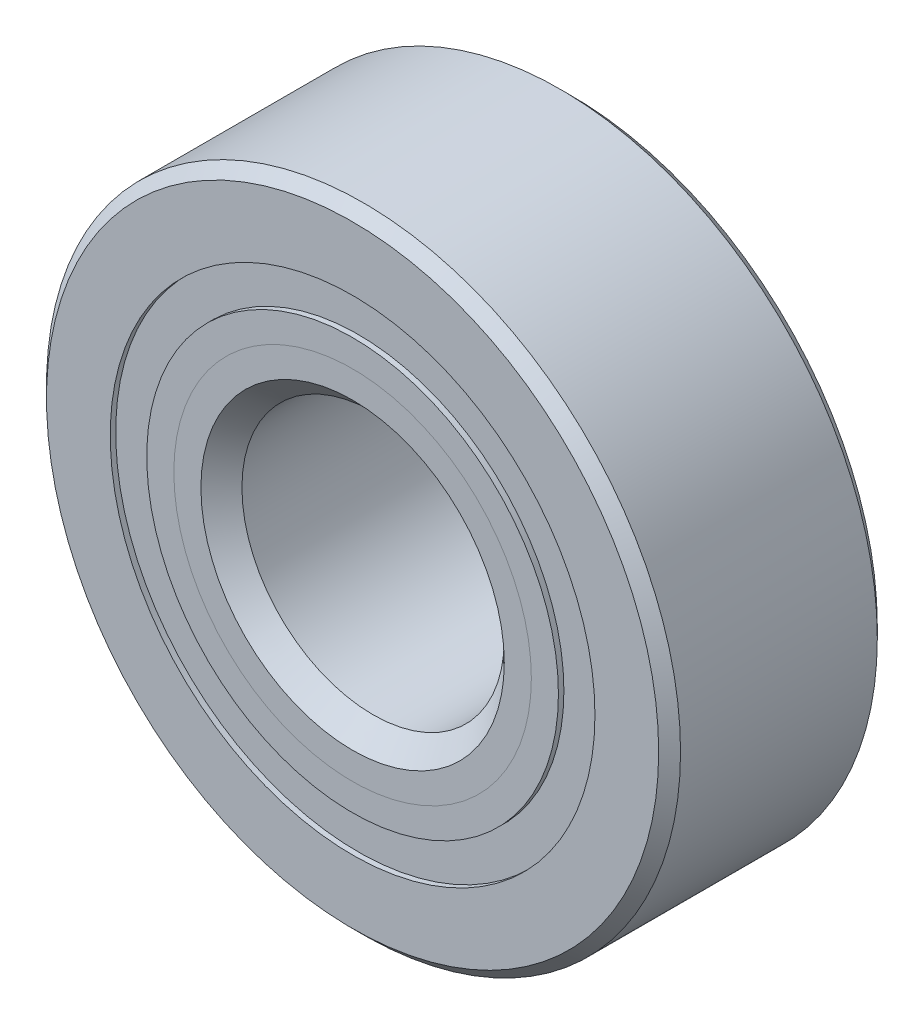
ISO-10303-21;
HEADER;
FILE_DESCRIPTION(('STEP AP214'),'2;1');
FILE_NAME('part.step','',(''),(''),'','','');
FILE_SCHEMA(('AUTOMOTIVE_DESIGN { 1 0 10303 214 1 1 1 1 }'));
ENDSEC;
DATA;
#1=APPLICATION_CONTEXT('core data for automotive mechanical design processes');
#2=APPLICATION_PROTOCOL_DEFINITION('international standard','automotive_design',2000,#1);
#3=PRODUCT_CONTEXT('',#1,'mechanical');
#4=PRODUCT('Part','Part','',(#3));
#5=PRODUCT_RELATED_PRODUCT_CATEGORY('part','',(#4));
#6=PRODUCT_DEFINITION_FORMATION('','',#4);
#7=PRODUCT_DEFINITION_CONTEXT('part definition',#1,'design');
#8=PRODUCT_DEFINITION('design','',#6,#7);
#9=PRODUCT_DEFINITION_SHAPE('','',#8);
#10=(LENGTH_UNIT() NAMED_UNIT(*) SI_UNIT(.MILLI.,.METRE.));
#11=(NAMED_UNIT(*) PLANE_ANGLE_UNIT() SI_UNIT($,.RADIAN.));
#12=(NAMED_UNIT(*) SI_UNIT($,.STERADIAN.) SOLID_ANGLE_UNIT());
#13=UNCERTAINTY_MEASURE_WITH_UNIT(LENGTH_MEASURE(1.E-05),#10,'distance_accuracy_value','');
#14=(GEOMETRIC_REPRESENTATION_CONTEXT(3) GLOBAL_UNCERTAINTY_ASSIGNED_CONTEXT((#13)) GLOBAL_UNIT_ASSIGNED_CONTEXT((#10,
#11,#12)) REPRESENTATION_CONTEXT('',''));
#15=CARTESIAN_POINT('',(0.,0.,0.));
#16=DIRECTION('',(0.,0.,1.));
#17=DIRECTION('',(1.,0.,0.));
#18=AXIS2_PLACEMENT_3D('',#15,#16,#17);
#19=CARTESIAN_POINT('',(0.,8.79884958791209,-3.7703125));
#20=DIRECTION('',(0.,0.,1.));
#21=DIRECTION('',(1.,0.,0.));
#22=AXIS2_PLACEMENT_3D('',#19,#20,#21);
#23=PLANE('',#22);
#24=CARTESIAN_POINT('',(0.,0.,-3.7703125));
#25=DIRECTION('',(0.,0.,1.));
#26=DIRECTION('',(1.,0.,0.));
#27=AXIS2_PLACEMENT_3D('',#24,#25,#26);
#28=CIRCLE('',#27,8.79884958791209);
#29=CARTESIAN_POINT('',(8.79884958791209,0.,-3.7703125));
#30=VERTEX_POINT('',#29);
#31=EDGE_CURVE('E62',#30,#30,#28,.T.);
#32=ORIENTED_EDGE('',*,*,#31,.F.);
#33=EDGE_LOOP('',(#32));
#34=FACE_BOUND('',#33,.T.);
#35=CARTESIAN_POINT('',(0.,0.,-3.7703125));
#36=DIRECTION('',(0.,0.,1.));
#37=DIRECTION('',(1.,0.,0.));
#38=AXIS2_PLACEMENT_3D('',#35,#36,#37);
#39=CIRCLE('',#38,7.47302541208792);
#40=CARTESIAN_POINT('',(7.47302541208792,0.,-3.7703125));
#41=VERTEX_POINT('',#40);
#42=EDGE_CURVE('E11',#41,#41,#39,.T.);
#43=ORIENTED_EDGE('',*,*,#42,.T.);
#44=EDGE_LOOP('',(#43));
#45=FACE_BOUND('',#44,.T.);
#46=ADVANCED_FACE('F48',(#34,#45),#23,.F.);
#47=CARTESIAN_POINT('',(0.,0.,3.96875));
#48=DIRECTION('',(0.,0.,1.));
#49=DIRECTION('',(1.,0.,0.));
#50=AXIS2_PLACEMENT_3D('',#47,#48,#49);
#51=CYLINDRICAL_SURFACE('',#50,7.47302541208792);
#52=ORIENTED_EDGE('',*,*,#42,.F.);
#53=EDGE_LOOP('',(#52));
#54=FACE_BOUND('',#53,.T.);
#55=CARTESIAN_POINT('',(0.,0.,-1.88434509807669));
#56=DIRECTION('',(0.,0.,1.));
#57=DIRECTION('',(1.,0.,0.));
#58=AXIS2_PLACEMENT_3D('',#55,#56,#57);
#59=CIRCLE('',#58,7.47302541208792);
#60=CARTESIAN_POINT('',(7.47302541208792,0.,-1.88434509807669));
#61=VERTEX_POINT('',#60);
#62=EDGE_CURVE('E54',#61,#61,#59,.T.);
#63=ORIENTED_EDGE('',*,*,#62,.T.);
#64=EDGE_LOOP('',(#63));
#65=FACE_BOUND('',#64,.T.);
#66=ADVANCED_FACE('F71',(#54,#65),#51,.F.);
#67=CARTESIAN_POINT('',(0.,8.79884958791209,-1.88434509807669));
#68=DIRECTION('',(0.,0.,-1.));
#69=DIRECTION('',(-1.,0.,0.));
#70=AXIS2_PLACEMENT_3D('',#67,#68,#69);
#71=PLANE('',#70);
#72=ORIENTED_EDGE('',*,*,#62,.F.);
#73=EDGE_LOOP('',(#72));
#74=FACE_BOUND('',#73,.T.);
#75=CARTESIAN_POINT('',(0.,0.,-1.88434509807669));
#76=DIRECTION('',(0.,0.,1.));
#77=DIRECTION('',(1.,0.,0.));
#78=AXIS2_PLACEMENT_3D('',#75,#76,#77);
#79=CIRCLE('',#78,8.79884958791209);
#80=CARTESIAN_POINT('',(8.79884958791209,0.,-1.88434509807669));
#81=VERTEX_POINT('',#80);
#82=EDGE_CURVE('E58',#81,#81,#79,.T.);
#83=ORIENTED_EDGE('',*,*,#82,.T.);
#84=EDGE_LOOP('',(#83));
#85=FACE_BOUND('',#84,.T.);
#86=ADVANCED_FACE('F75',(#74,#85),#71,.F.);
#87=CARTESIAN_POINT('',(0.,0.,3.96875));
#88=DIRECTION('',(0.,0.,1.));
#89=DIRECTION('',(1.,0.,0.));
#90=AXIS2_PLACEMENT_3D('',#87,#88,#89);
#91=CYLINDRICAL_SURFACE('',#90,8.79884958791209);
#92=ORIENTED_EDGE('',*,*,#82,.F.);
#93=EDGE_LOOP('',(#92));
#94=FACE_BOUND('',#93,.T.);
#95=ORIENTED_EDGE('',*,*,#31,.T.);
#96=EDGE_LOOP('',(#95));
#97=FACE_BOUND('',#96,.T.);
#98=ADVANCED_FACE('F68',(#94,#97),#91,.T.);
#99=CLOSED_SHELL('',(#46,#66,#86,#98));
#100=MANIFOLD_SOLID_BREP('B2',#99);
#101=CARTESIAN_POINT('',(0.,8.79884958791209,3.7703125));
#102=DIRECTION('',(0.,0.,-1.));
#103=DIRECTION('',(-1.,0.,0.));
#104=AXIS2_PLACEMENT_3D('',#101,#102,#103);
#105=PLANE('',#104);
#106=CARTESIAN_POINT('',(0.,0.,3.7703125));
#107=DIRECTION('',(0.,0.,1.));
#108=DIRECTION('',(1.,0.,0.));
#109=AXIS2_PLACEMENT_3D('',#106,#107,#108);
#110=CIRCLE('',#109,7.47302541208791);
#111=CARTESIAN_POINT('',(7.47302541208791,0.,3.7703125));
#112=VERTEX_POINT('',#111);
#113=EDGE_CURVE('E47',#112,#112,#110,.T.);
#114=ORIENTED_EDGE('',*,*,#113,.F.);
#115=EDGE_LOOP('',(#114));
#116=FACE_BOUND('',#115,.T.);
#117=CARTESIAN_POINT('',(0.,0.,3.7703125));
#118=DIRECTION('',(0.,0.,1.));
#119=DIRECTION('',(1.,0.,0.));
#120=AXIS2_PLACEMENT_3D('',#117,#118,#119);
#121=CIRCLE('',#120,8.79884958791209);
#122=CARTESIAN_POINT('',(8.79884958791209,0.,3.7703125));
#123=VERTEX_POINT('',#122);
#124=EDGE_CURVE('E130',#123,#123,#121,.T.);
#125=ORIENTED_EDGE('',*,*,#124,.T.);
#126=EDGE_LOOP('',(#125));
#127=FACE_BOUND('',#126,.T.);
#128=ADVANCED_FACE('F116',(#116,#127),#105,.F.);
#129=CARTESIAN_POINT('',(0.,0.,3.96875));
#130=DIRECTION('',(0.,0.,1.));
#131=DIRECTION('',(1.,0.,0.));
#132=AXIS2_PLACEMENT_3D('',#129,#130,#131);
#133=CYLINDRICAL_SURFACE('',#132,7.47302541208791);
#134=CARTESIAN_POINT('',(0.,0.,1.88434509807669));
#135=DIRECTION('',(0.,0.,1.));
#136=DIRECTION('',(1.,0.,0.));
#137=AXIS2_PLACEMENT_3D('',#134,#135,#136);
#138=CIRCLE('',#137,7.47302541208791);
#139=CARTESIAN_POINT('',(7.47302541208791,0.,1.88434509807669));
#140=VERTEX_POINT('',#139);
#141=EDGE_CURVE('E122',#140,#140,#138,.T.);
#142=ORIENTED_EDGE('',*,*,#141,.F.);
#143=EDGE_LOOP('',(#142));
#144=FACE_BOUND('',#143,.T.);
#145=ORIENTED_EDGE('',*,*,#113,.T.);
#146=EDGE_LOOP('',(#145));
#147=FACE_BOUND('',#146,.T.);
#148=ADVANCED_FACE('F145',(#144,#147),#133,.F.);
#149=CARTESIAN_POINT('',(0.,8.79884958791209,1.88434509807669));
#150=DIRECTION('',(0.,0.,1.));
#151=DIRECTION('',(1.,0.,0.));
#152=AXIS2_PLACEMENT_3D('',#149,#150,#151);
#153=PLANE('',#152);
#154=CARTESIAN_POINT('',(0.,0.,1.88434509807669));
#155=DIRECTION('',(0.,0.,1.));
#156=DIRECTION('',(1.,0.,0.));
#157=AXIS2_PLACEMENT_3D('',#154,#155,#156);
#158=CIRCLE('',#157,8.79884958791209);
#159=CARTESIAN_POINT('',(8.79884958791209,0.,1.88434509807669));
#160=VERTEX_POINT('',#159);
#161=EDGE_CURVE('E126',#160,#160,#158,.T.);
#162=ORIENTED_EDGE('',*,*,#161,.F.);
#163=EDGE_LOOP('',(#162));
#164=FACE_BOUND('',#163,.T.);
#165=ORIENTED_EDGE('',*,*,#141,.T.);
#166=EDGE_LOOP('',(#165));
#167=FACE_BOUND('',#166,.T.);
#168=ADVANCED_FACE('F140',(#164,#167),#153,.F.);
#169=CARTESIAN_POINT('',(0.,0.,3.96875));
#170=DIRECTION('',(0.,0.,1.));
#171=DIRECTION('',(1.,0.,0.));
#172=AXIS2_PLACEMENT_3D('',#169,#170,#171);
#173=CYLINDRICAL_SURFACE('',#172,8.79884958791209);
#174=ORIENTED_EDGE('',*,*,#124,.F.);
#175=EDGE_LOOP('',(#174));
#176=FACE_BOUND('',#175,.T.);
#177=ORIENTED_EDGE('',*,*,#161,.T.);
#178=EDGE_LOOP('',(#177));
#179=FACE_BOUND('',#178,.T.);
#180=ADVANCED_FACE('F137',(#176,#179),#173,.T.);
#181=CLOSED_SHELL('',(#128,#148,#168,#180));
#182=MANIFOLD_SOLID_BREP('B6',#181);
#183=CARTESIAN_POINT('',(-4.06796874999991,7.04592855860251,0.));
#184=DIRECTION('',(0.,0.,1.));
#185=DIRECTION('',(-0.499999999999989,0.866025403784445,0.));
#186=AXIS2_PLACEMENT_3D('',#183,#184,#185);
#187=SPHERICAL_SURFACE('',#186,1.88434509807669);
#188=CARTESIAN_POINT('',(-4.06796874999991,7.04592855860251,1.88434509807669));
#189=VERTEX_POINT('',#188);
#190=VERTEX_LOOP('',#189);
#191=FACE_BOUND('',#190,.T.);
#192=ADVANCED_FACE('F184',(#191),#187,.T.);
#193=CLOSED_SHELL('',(#192));
#194=MANIFOLD_SOLID_BREP('B42',#193);
#195=CARTESIAN_POINT('',(-7.04592855860241,4.06796875000008,0.));
#196=DIRECTION('',(0.,0.,1.));
#197=DIRECTION('',(-0.866025403784433,0.50000000000001,0.));
#198=AXIS2_PLACEMENT_3D('',#195,#196,#197);
#199=SPHERICAL_SURFACE('',#198,1.88434509807669);
#200=CARTESIAN_POINT('',(-7.04592855860241,4.06796875000008,1.88434509807669));
#201=VERTEX_POINT('',#200);
#202=VERTEX_LOOP('',#201);
#203=FACE_BOUND('',#202,.T.);
#204=ADVANCED_FACE('F218',(#203),#199,.T.);
#205=CLOSED_SHELL('',(#204));
#206=MANIFOLD_SOLID_BREP('B112',#205);
#207=CARTESIAN_POINT('',(-8.1359375,0.,0.));
#208=DIRECTION('',(0.,0.,1.));
#209=DIRECTION('',(-1.,0.,0.));
#210=AXIS2_PLACEMENT_3D('',#207,#208,#209);
#211=SPHERICAL_SURFACE('',#210,1.88434509807669);
#212=CARTESIAN_POINT('',(-8.1359375,0.,1.88434509807669));
#213=VERTEX_POINT('',#212);
#214=VERTEX_LOOP('',#213);
#215=FACE_BOUND('',#214,.T.);
#216=ADVANCED_FACE('F252',(#215),#211,.T.);
#217=CLOSED_SHELL('',(#216));
#218=MANIFOLD_SOLID_BREP('B180',#217);
#219=CARTESIAN_POINT('',(-7.04592855860249,-4.06796874999993,0.));
#220=DIRECTION('',(0.,0.,1.));
#221=DIRECTION('',(-0.866025403784443,-0.499999999999992,0.));
#222=AXIS2_PLACEMENT_3D('',#219,#220,#221);
#223=SPHERICAL_SURFACE('',#222,1.88434509807669);
#224=CARTESIAN_POINT('',(-7.04592855860249,-4.06796874999993,1.88434509807669));
#225=VERTEX_POINT('',#224);
#226=VERTEX_LOOP('',#225);
#227=FACE_BOUND('',#226,.T.);
#228=ADVANCED_FACE('F286',(#227),#223,.T.);
#229=CLOSED_SHELL('',(#228));
#230=MANIFOLD_SOLID_BREP('B214',#229);
#231=CARTESIAN_POINT('',(-4.06796875000006,-7.04592855860242,0.));
#232=DIRECTION('',(0.,0.,1.));
#233=DIRECTION('',(-0.500000000000007,-0.866025403784435,0.));
#234=AXIS2_PLACEMENT_3D('',#231,#232,#233);
#235=SPHERICAL_SURFACE('',#234,1.88434509807669);
#236=CARTESIAN_POINT('',(-4.06796875000006,-7.04592855860242,1.88434509807669));
#237=VERTEX_POINT('',#236);
#238=VERTEX_LOOP('',#237);
#239=FACE_BOUND('',#238,.T.);
#240=ADVANCED_FACE('F320',(#239),#235,.T.);
#241=CLOSED_SHELL('',(#240));
#242=MANIFOLD_SOLID_BREP('B248',#241);
#243=CARTESIAN_POINT('',(0.,-8.1359375,0.));
#244=DIRECTION('',(0.,0.,1.));
#245=DIRECTION('',(0.,-1.,0.));
#246=AXIS2_PLACEMENT_3D('',#243,#244,#245);
#247=SPHERICAL_SURFACE('',#246,1.88434509807669);
#248=CARTESIAN_POINT('',(0.,-8.1359375,1.88434509807669));
#249=VERTEX_POINT('',#248);
#250=VERTEX_LOOP('',#249);
#251=FACE_BOUND('',#250,.T.);
#252=ADVANCED_FACE('F354',(#251),#247,.T.);
#253=CLOSED_SHELL('',(#252));
#254=MANIFOLD_SOLID_BREP('B282',#253);
#255=CARTESIAN_POINT('',(4.06796874999996,-7.04592855860248,0.));
#256=DIRECTION('',(0.,0.,1.));
#257=DIRECTION('',(0.499999999999995,-0.866025403784442,0.));
#258=AXIS2_PLACEMENT_3D('',#255,#256,#257);
#259=SPHERICAL_SURFACE('',#258,1.88434509807669);
#260=CARTESIAN_POINT('',(4.06796874999996,-7.04592855860248,1.88434509807669));
#261=VERTEX_POINT('',#260);
#262=VERTEX_LOOP('',#261);
#263=FACE_BOUND('',#262,.T.);
#264=ADVANCED_FACE('F388',(#263),#259,.T.);
#265=CLOSED_SHELL('',(#264));
#266=MANIFOLD_SOLID_BREP('B316',#265);
#267=CARTESIAN_POINT('',(7.04592855860244,-4.06796875000003,0.));
#268=DIRECTION('',(0.,0.,1.));
#269=DIRECTION('',(0.866025403784436,-0.500000000000004,0.));
#270=AXIS2_PLACEMENT_3D('',#267,#268,#269);
#271=SPHERICAL_SURFACE('',#270,1.88434509807669);
#272=CARTESIAN_POINT('',(7.04592855860244,-4.06796875000003,1.88434509807669));
#273=VERTEX_POINT('',#272);
#274=VERTEX_LOOP('',#273);
#275=FACE_BOUND('',#274,.T.);
#276=ADVANCED_FACE('F422',(#275),#271,.T.);
#277=CLOSED_SHELL('',(#276));
#278=MANIFOLD_SOLID_BREP('B350',#277);
#279=CARTESIAN_POINT('',(8.1359375,0.,0.));
#280=DIRECTION('',(0.,0.,1.));
#281=DIRECTION('',(1.,0.,0.));
#282=AXIS2_PLACEMENT_3D('',#279,#280,#281);
#283=SPHERICAL_SURFACE('',#282,1.88434509807669);
#284=CARTESIAN_POINT('',(8.1359375,0.,1.88434509807669));
#285=VERTEX_POINT('',#284);
#286=VERTEX_LOOP('',#285);
#287=FACE_BOUND('',#286,.T.);
#288=ADVANCED_FACE('F456',(#287),#283,.T.);
#289=CLOSED_SHELL('',(#288));
#290=MANIFOLD_SOLID_BREP('B384',#289);
#291=CARTESIAN_POINT('',(7.04592855860247,4.06796874999998,0.));
#292=DIRECTION('',(0.,0.,1.));
#293=DIRECTION('',(0.86602540378444,0.499999999999998,0.));
#294=AXIS2_PLACEMENT_3D('',#291,#292,#293);
#295=SPHERICAL_SURFACE('',#294,1.88434509807669);
#296=CARTESIAN_POINT('',(7.04592855860247,4.06796874999998,1.88434509807669));
#297=VERTEX_POINT('',#296);
#298=VERTEX_LOOP('',#297);
#299=FACE_BOUND('',#298,.T.);
#300=ADVANCED_FACE('F490',(#299),#295,.T.);
#301=CLOSED_SHELL('',(#300));
#302=MANIFOLD_SOLID_BREP('B418',#301);
#303=CARTESIAN_POINT('',(4.06796875000001,7.04592855860245,0.));
#304=DIRECTION('',(0.,0.,1.));
#305=DIRECTION('',(0.500000000000001,0.866025403784438,0.));
#306=AXIS2_PLACEMENT_3D('',#303,#304,#305);
#307=SPHERICAL_SURFACE('',#306,1.88434509807669);
#308=CARTESIAN_POINT('',(4.06796875000001,7.04592855860245,1.88434509807669));
#309=VERTEX_POINT('',#308);
#310=VERTEX_LOOP('',#309);
#311=FACE_BOUND('',#310,.T.);
#312=ADVANCED_FACE('F524',(#311),#307,.T.);
#313=CLOSED_SHELL('',(#312));
#314=MANIFOLD_SOLID_BREP('B452',#313);
#315=CARTESIAN_POINT('',(0.,8.1359375,0.));
#316=DIRECTION('',(0.,0.,1.));
#317=DIRECTION('',(0.,1.,0.));
#318=AXIS2_PLACEMENT_3D('',#315,#316,#317);
#319=SPHERICAL_SURFACE('',#318,1.88434509807669);
#320=CARTESIAN_POINT('',(0.,8.1359375,1.88434509807669));
#321=VERTEX_POINT('',#320);
#322=VERTEX_LOOP('',#321);
#323=FACE_BOUND('',#322,.T.);
#324=ADVANCED_FACE('F560',(#323),#319,.T.);
#325=CLOSED_SHELL('',(#324));
#326=MANIFOLD_SOLID_BREP('B486',#325);
#327=CARTESIAN_POINT('',(0.,6.49003580652479,3.96875));
#328=DIRECTION('',(0.,0.,-1.));
#329=DIRECTION('',(-1.,0.,0.));
#330=AXIS2_PLACEMENT_3D('',#327,#328,#329);
#331=PLANE('',#330);
#332=CARTESIAN_POINT('',(0.,0.,3.96875));
#333=DIRECTION('',(0.,0.,1.));
#334=DIRECTION('',(1.,0.,0.));
#335=AXIS2_PLACEMENT_3D('',#332,#333,#334);
#336=CIRCLE('',#335,5.50704620096166);
#337=CARTESIAN_POINT('',(5.50704620096166,0.,3.96875));
#338=VERTEX_POINT('',#337);
#339=EDGE_CURVE('E615',#338,#338,#336,.T.);
#340=ORIENTED_EDGE('',*,*,#339,.F.);
#341=EDGE_LOOP('',(#340));
#342=FACE_BOUND('',#341,.T.);
#343=CARTESIAN_POINT('',(0.,0.,3.96875));
#344=DIRECTION('',(0.,0.,1.));
#345=DIRECTION('',(1.,0.,0.));
#346=AXIS2_PLACEMENT_3D('',#343,#344,#345);
#347=CIRCLE('',#346,6.49003580652479);
#348=CARTESIAN_POINT('',(6.49003580652479,0.,3.96875));
#349=VERTEX_POINT('',#348);
#350=EDGE_CURVE('E559',#349,#349,#347,.T.);
#351=ORIENTED_EDGE('',*,*,#350,.T.);
#352=EDGE_LOOP('',(#351));
#353=FACE_BOUND('',#352,.T.);
#354=ADVANCED_FACE('F581',(#342,#353),#331,.F.);
#355=CARTESIAN_POINT('',(0.,0.,2.98576039443688));
#356=DIRECTION('',(0.,0.,1.));
#357=DIRECTION('',(1.,0.,0.));
#358=AXIS2_PLACEMENT_3D('',#355,#356,#357);
#359=CONICAL_SURFACE('',#358,5.50704620096166,0.78539816339745);
#360=ORIENTED_EDGE('',*,*,#350,.F.);
#361=EDGE_LOOP('',(#360));
#362=FACE_BOUND('',#361,.T.);
#363=CARTESIAN_POINT('',(0.,0.,2.98576039443688));
#364=DIRECTION('',(0.,0.,1.));
#365=DIRECTION('',(1.,0.,0.));
#366=AXIS2_PLACEMENT_3D('',#363,#364,#365);
#367=CIRCLE('',#366,5.50704620096166);
#368=CARTESIAN_POINT('',(5.50704620096166,0.,2.98576039443688));
#369=VERTEX_POINT('',#368);
#370=EDGE_CURVE('E587',#369,#369,#367,.T.);
#371=ORIENTED_EDGE('',*,*,#370,.T.);
#372=EDGE_LOOP('',(#371));
#373=FACE_BOUND('',#372,.T.);
#374=ADVANCED_FACE('F622',(#362,#373),#359,.T.);
#375=CARTESIAN_POINT('',(0.,0.,3.96875));
#376=DIRECTION('',(0.,0.,1.));
#377=DIRECTION('',(1.,0.,0.));
#378=AXIS2_PLACEMENT_3D('',#375,#376,#377);
#379=CYLINDRICAL_SURFACE('',#378,5.50704620096166);
#380=ORIENTED_EDGE('',*,*,#370,.F.);
#381=EDGE_LOOP('',(#380));
#382=FACE_BOUND('',#381,.T.);
#383=CARTESIAN_POINT('',(0.,0.,0.));
#384=DIRECTION('',(0.,0.,1.));
#385=DIRECTION('',(1.,0.,0.));
#386=AXIS2_PLACEMENT_3D('',#383,#384,#385);
#387=CIRCLE('',#386,5.50704620096166);
#388=CARTESIAN_POINT('',(5.50704620096166,0.,0.));
#389=VERTEX_POINT('',#388);
#390=EDGE_CURVE('E591',#389,#389,#387,.T.);
#391=ORIENTED_EDGE('',*,*,#390,.T.);
#392=EDGE_LOOP('',(#391));
#393=FACE_BOUND('',#392,.T.);
#394=ADVANCED_FACE('F626',(#382,#393),#379,.T.);
#395=CARTESIAN_POINT('',(0.,5.50704620096166,0.));
#396=DIRECTION('',(0.,0.,-1.));
#397=DIRECTION('',(-1.,0.,0.));
#398=AXIS2_PLACEMENT_3D('',#395,#396,#397);
#399=PLANE('',#398);
#400=ORIENTED_EDGE('',*,*,#390,.F.);
#401=EDGE_LOOP('',(#400));
#402=FACE_BOUND('',#401,.T.);
#403=CARTESIAN_POINT('',(0.,0.,0.));
#404=DIRECTION('',(0.,0.,1.));
#405=DIRECTION('',(1.,0.,0.));
#406=AXIS2_PLACEMENT_3D('',#403,#404,#405);
#407=CIRCLE('',#406,6.25159240192331);
#408=CARTESIAN_POINT('',(6.25159240192331,0.,0.));
#409=VERTEX_POINT('',#408);
#410=EDGE_CURVE('E595',#409,#409,#407,.T.);
#411=ORIENTED_EDGE('',*,*,#410,.T.);
#412=EDGE_LOOP('',(#411));
#413=FACE_BOUND('',#412,.T.);
#414=ADVANCED_FACE('F631',(#402,#413),#399,.F.);
#415=CARTESIAN_POINT('',(0.,0.,0.));
#416=DIRECTION('',(0.,0.,1.));
#417=DIRECTION('',(1.,0.,0.));
#418=AXIS2_PLACEMENT_3D('',#415,#416,#417);
#419=TOROIDAL_SURFACE('',#418,8.1359375,1.88434509807669);
#420=ORIENTED_EDGE('',*,*,#410,.F.);
#421=EDGE_LOOP('',(#420));
#422=FACE_BOUND('',#421,.T.);
#423=CARTESIAN_POINT('',(0.,0.,-1.76388888888889));
#424=DIRECTION('',(0.,0.,1.));
#425=DIRECTION('',(1.,0.,0.));
#426=AXIS2_PLACEMENT_3D('',#423,#424,#425);
#427=CIRCLE('',#426,7.47302541208791);
#428=CARTESIAN_POINT('',(7.47302541208791,0.,-1.76388888888889));
#429=VERTEX_POINT('',#428);
#430=EDGE_CURVE('E600',#429,#429,#427,.T.);
#431=ORIENTED_EDGE('',*,*,#430,.T.);
#432=EDGE_LOOP('',(#431));
#433=FACE_BOUND('',#432,.T.);
#434=ADVANCED_FACE('F637',(#422,#433),#419,.F.);
#435=CARTESIAN_POINT('',(0.,0.,3.96875));
#436=DIRECTION('',(0.,0.,1.));
#437=DIRECTION('',(1.,0.,0.));
#438=AXIS2_PLACEMENT_3D('',#435,#436,#437);
#439=CYLINDRICAL_SURFACE('',#438,7.47302541208792);
#440=ORIENTED_EDGE('',*,*,#430,.F.);
#441=EDGE_LOOP('',(#440));
#442=FACE_BOUND('',#441,.T.);
#443=CARTESIAN_POINT('',(0.,0.,-3.96875000000001));
#444=DIRECTION('',(0.,0.,1.));
#445=DIRECTION('',(1.,0.,0.));
#446=AXIS2_PLACEMENT_3D('',#443,#444,#445);
#447=CIRCLE('',#446,7.47302541208792);
#448=CARTESIAN_POINT('',(7.47302541208792,0.,-3.96875000000001));
#449=VERTEX_POINT('',#448);
#450=EDGE_CURVE('E603',#449,#449,#447,.T.);
#451=ORIENTED_EDGE('',*,*,#450,.T.);
#452=EDGE_LOOP('',(#451));
#453=FACE_BOUND('',#452,.T.);
#454=ADVANCED_FACE('F641',(#442,#453),#439,.T.);
#455=CARTESIAN_POINT('',(0.,5.159375,-3.96875));
#456=DIRECTION('',(0.,0.,1.));
#457=DIRECTION('',(1.,0.,0.));
#458=AXIS2_PLACEMENT_3D('',#455,#456,#457);
#459=PLANE('',#458);
#460=ORIENTED_EDGE('',*,*,#450,.F.);
#461=EDGE_LOOP('',(#460));
#462=FACE_BOUND('',#461,.T.);
#463=CARTESIAN_POINT('',(0.,0.,-3.96875));
#464=DIRECTION('',(0.,0.,1.));
#465=DIRECTION('',(1.,0.,0.));
#466=AXIS2_PLACEMENT_3D('',#463,#464,#465);
#467=CIRCLE('',#466,5.159375);
#468=CARTESIAN_POINT('',(5.159375,0.,-3.96875));
#469=VERTEX_POINT('',#468);
#470=EDGE_CURVE('E606',#469,#469,#467,.T.);
#471=ORIENTED_EDGE('',*,*,#470,.T.);
#472=EDGE_LOOP('',(#471));
#473=FACE_BOUND('',#472,.T.);
#474=ADVANCED_FACE('F645',(#462,#473),#459,.F.);
#475=CARTESIAN_POINT('',(0.,0.,-3.571875));
#476=DIRECTION('',(0.,0.,-1.));
#477=DIRECTION('',(-1.,0.,0.));
#478=AXIS2_PLACEMENT_3D('',#475,#476,#477);
#479=CONICAL_SURFACE('',#478,4.7625,0.785398163397448);
#480=ORIENTED_EDGE('',*,*,#470,.F.);
#481=EDGE_LOOP('',(#480));
#482=FACE_BOUND('',#481,.T.);
#483=CARTESIAN_POINT('',(0.,0.,-3.571875));
#484=DIRECTION('',(0.,0.,1.));
#485=DIRECTION('',(1.,0.,0.));
#486=AXIS2_PLACEMENT_3D('',#483,#484,#485);
#487=CIRCLE('',#486,4.7625);
#488=CARTESIAN_POINT('',(4.7625,0.,-3.571875));
#489=VERTEX_POINT('',#488);
#490=EDGE_CURVE('E609',#489,#489,#487,.T.);
#491=ORIENTED_EDGE('',*,*,#490,.T.);
#492=EDGE_LOOP('',(#491));
#493=FACE_BOUND('',#492,.T.);
#494=ADVANCED_FACE('F649',(#482,#493),#479,.F.);
#495=CARTESIAN_POINT('',(0.,0.,3.96875));
#496=DIRECTION('',(0.,0.,1.));
#497=DIRECTION('',(1.,0.,0.));
#498=AXIS2_PLACEMENT_3D('',#495,#496,#497);
#499=CYLINDRICAL_SURFACE('',#498,4.7625);
#500=ORIENTED_EDGE('',*,*,#490,.F.);
#501=EDGE_LOOP('',(#500));
#502=FACE_BOUND('',#501,.T.);
#503=CARTESIAN_POINT('',(0.,0.,3.22420379903835));
#504=DIRECTION('',(0.,0.,1.));
#505=DIRECTION('',(1.,0.,0.));
#506=AXIS2_PLACEMENT_3D('',#503,#504,#505);
#507=CIRCLE('',#506,4.7625);
#508=CARTESIAN_POINT('',(4.7625,0.,3.22420379903835));
#509=VERTEX_POINT('',#508);
#510=EDGE_CURVE('E612',#509,#509,#507,.T.);
#511=ORIENTED_EDGE('',*,*,#510,.T.);
#512=EDGE_LOOP('',(#511));
#513=FACE_BOUND('',#512,.T.);
#514=ADVANCED_FACE('F653',(#502,#513),#499,.F.);
#515=CARTESIAN_POINT('',(0.,0.,3.96875));
#516=DIRECTION('',(0.,0.,1.));
#517=DIRECTION('',(1.,0.,0.));
#518=AXIS2_PLACEMENT_3D('',#515,#516,#517);
#519=CONICAL_SURFACE('',#518,5.50704620096166,0.78539816339745);
#520=ORIENTED_EDGE('',*,*,#510,.F.);
#521=EDGE_LOOP('',(#520));
#522=FACE_BOUND('',#521,.T.);
#523=ORIENTED_EDGE('',*,*,#339,.T.);
#524=EDGE_LOOP('',(#523));
#525=FACE_BOUND('',#524,.T.);
#526=ADVANCED_FACE('F619',(#522,#525),#519,.F.);
#527=CLOSED_SHELL('',(#354,#374,#394,#414,#434,#454,#474,#494,#514,#526));
#528=MANIFOLD_SOLID_BREP('B520',#527);
#529=CARTESIAN_POINT('',(0.,7.47302541208791,3.96875));
#530=DIRECTION('',(0.,0.,-1.));
#531=DIRECTION('',(-1.,0.,0.));
#532=AXIS2_PLACEMENT_3D('',#529,#530,#531);
#533=PLANE('',#532);
#534=CARTESIAN_POINT('',(0.,0.,3.96875));
#535=DIRECTION('',(0.,0.,1.));
#536=DIRECTION('',(1.,0.,0.));
#537=AXIS2_PLACEMENT_3D('',#534,#535,#536);
#538=CIRCLE('',#537,6.49003580652479);
#539=CARTESIAN_POINT('',(6.49003580652479,0.,3.96875));
#540=VERTEX_POINT('',#539);
#541=EDGE_CURVE('E580',#540,#540,#538,.T.);
#542=ORIENTED_EDGE('',*,*,#541,.F.);
#543=EDGE_LOOP('',(#542));
#544=FACE_BOUND('',#543,.T.);
#545=CARTESIAN_POINT('',(0.,0.,3.96875));
#546=DIRECTION('',(0.,0.,1.));
#547=DIRECTION('',(1.,0.,0.));
#548=AXIS2_PLACEMENT_3D('',#545,#546,#547);
#549=CIRCLE('',#548,7.47302541208791);
#550=CARTESIAN_POINT('',(7.47302541208791,0.,3.96875));
#551=VERTEX_POINT('',#550);
#552=EDGE_CURVE('E762',#551,#551,#549,.T.);
#553=ORIENTED_EDGE('',*,*,#552,.T.);
#554=EDGE_LOOP('',(#553));
#555=FACE_BOUND('',#554,.T.);
#556=ADVANCED_FACE('F740',(#544,#555),#533,.F.);
#557=CARTESIAN_POINT('',(0.,0.,3.96875));
#558=DIRECTION('',(0.,0.,1.));
#559=DIRECTION('',(1.,0.,0.));
#560=AXIS2_PLACEMENT_3D('',#557,#558,#559);
#561=CONICAL_SURFACE('',#560,6.49003580652479,0.78539816339745);
#562=CARTESIAN_POINT('',(0.,0.,2.98576039443688));
#563=DIRECTION('',(0.,0.,1.));
#564=DIRECTION('',(1.,0.,0.));
#565=AXIS2_PLACEMENT_3D('',#562,#563,#564);
#566=CIRCLE('',#565,5.50704620096166);
#567=CARTESIAN_POINT('',(5.50704620096166,0.,2.98576039443688));
#568=VERTEX_POINT('',#567);
#569=EDGE_CURVE('E746',#568,#568,#566,.T.);
#570=ORIENTED_EDGE('',*,*,#569,.F.);
#571=EDGE_LOOP('',(#570));
#572=FACE_BOUND('',#571,.T.);
#573=ORIENTED_EDGE('',*,*,#541,.T.);
#574=EDGE_LOOP('',(#573));
#575=FACE_BOUND('',#574,.T.);
#576=ADVANCED_FACE('F787',(#572,#575),#561,.F.);
#577=CARTESIAN_POINT('',(0.,0.,3.96875));
#578=DIRECTION('',(0.,0.,1.));
#579=DIRECTION('',(1.,0.,0.));
#580=AXIS2_PLACEMENT_3D('',#577,#578,#579);
#581=CYLINDRICAL_SURFACE('',#580,5.50704620096166);
#582=CARTESIAN_POINT('',(0.,0.,0.));
#583=DIRECTION('',(0.,0.,1.));
#584=DIRECTION('',(1.,0.,0.));
#585=AXIS2_PLACEMENT_3D('',#582,#583,#584);
#586=CIRCLE('',#585,5.50704620096166);
#587=CARTESIAN_POINT('',(5.50704620096166,0.,0.));
#588=VERTEX_POINT('',#587);
#589=EDGE_CURVE('E750',#588,#588,#586,.T.);
#590=ORIENTED_EDGE('',*,*,#589,.F.);
#591=EDGE_LOOP('',(#590));
#592=FACE_BOUND('',#591,.T.);
#593=ORIENTED_EDGE('',*,*,#569,.T.);
#594=EDGE_LOOP('',(#593));
#595=FACE_BOUND('',#594,.T.);
#596=ADVANCED_FACE('F782',(#592,#595),#581,.F.);
#597=CARTESIAN_POINT('',(0.,5.50704620096166,0.));
#598=DIRECTION('',(0.,0.,1.));
#599=DIRECTION('',(1.,0.,0.));
#600=AXIS2_PLACEMENT_3D('',#597,#598,#599);
#601=PLANE('',#600);
#602=CARTESIAN_POINT('',(0.,0.,0.));
#603=DIRECTION('',(0.,0.,1.));
#604=DIRECTION('',(1.,0.,0.));
#605=AXIS2_PLACEMENT_3D('',#602,#603,#604);
#606=CIRCLE('',#605,6.25159240192331);
#607=CARTESIAN_POINT('',(6.25159240192331,0.,0.));
#608=VERTEX_POINT('',#607);
#609=EDGE_CURVE('E754',#608,#608,#606,.T.);
#610=ORIENTED_EDGE('',*,*,#609,.F.);
#611=EDGE_LOOP('',(#610));
#612=FACE_BOUND('',#611,.T.);
#613=ORIENTED_EDGE('',*,*,#589,.T.);
#614=EDGE_LOOP('',(#613));
#615=FACE_BOUND('',#614,.T.);
#616=ADVANCED_FACE('F776',(#612,#615),#601,.F.);
#617=CARTESIAN_POINT('',(0.,0.,0.));
#618=DIRECTION('',(0.,0.,1.));
#619=DIRECTION('',(1.,0.,0.));
#620=AXIS2_PLACEMENT_3D('',#617,#618,#619);
#621=TOROIDAL_SURFACE('',#620,8.1359375,1.88434509807669);
#622=CARTESIAN_POINT('',(0.,0.,1.76388888888889));
#623=DIRECTION('',(0.,0.,1.));
#624=DIRECTION('',(1.,0.,0.));
#625=AXIS2_PLACEMENT_3D('',#622,#623,#624);
#626=CIRCLE('',#625,7.47302541208791);
#627=CARTESIAN_POINT('',(7.47302541208791,0.,1.76388888888889));
#628=VERTEX_POINT('',#627);
#629=EDGE_CURVE('E759',#628,#628,#626,.T.);
#630=ORIENTED_EDGE('',*,*,#629,.F.);
#631=EDGE_LOOP('',(#630));
#632=FACE_BOUND('',#631,.T.);
#633=ORIENTED_EDGE('',*,*,#609,.T.);
#634=EDGE_LOOP('',(#633));
#635=FACE_BOUND('',#634,.T.);
#636=ADVANCED_FACE('F770',(#632,#635),#621,.F.);
#637=CARTESIAN_POINT('',(0.,0.,3.96875));
#638=DIRECTION('',(0.,0.,1.));
#639=DIRECTION('',(1.,0.,0.));
#640=AXIS2_PLACEMENT_3D('',#637,#638,#639);
#641=CYLINDRICAL_SURFACE('',#640,7.47302541208791);
#642=ORIENTED_EDGE('',*,*,#552,.F.);
#643=EDGE_LOOP('',(#642));
#644=FACE_BOUND('',#643,.T.);
#645=ORIENTED_EDGE('',*,*,#629,.T.);
#646=EDGE_LOOP('',(#645));
#647=FACE_BOUND('',#646,.T.);
#648=ADVANCED_FACE('F767',(#644,#647),#641,.T.);
#649=CLOSED_SHELL('',(#556,#576,#596,#616,#636,#648));
#650=MANIFOLD_SOLID_BREP('B554',#649);
#651=CARTESIAN_POINT('',(0.,0.,3.571875));
#652=DIRECTION('',(0.,0.,-1.));
#653=DIRECTION('',(-1.,0.,0.));
#654=AXIS2_PLACEMENT_3D('',#651,#652,#653);
#655=CONICAL_SURFACE('',#654,11.509375,0.785398163397445);
#656=CARTESIAN_POINT('',(0.,0.,3.96875));
#657=DIRECTION('',(0.,0.,1.));
#658=DIRECTION('',(1.,0.,0.));
#659=AXIS2_PLACEMENT_3D('',#656,#657,#658);
#660=CIRCLE('',#659,11.1125);
#661=CARTESIAN_POINT('',(11.1125,0.,3.96875));
#662=VERTEX_POINT('',#661);
#663=EDGE_CURVE('E860',#662,#662,#660,.T.);
#664=ORIENTED_EDGE('',*,*,#663,.F.);
#665=EDGE_LOOP('',(#664));
#666=FACE_BOUND('',#665,.T.);
#667=CARTESIAN_POINT('',(0.,0.,3.571875));
#668=DIRECTION('',(0.,0.,1.));
#669=DIRECTION('',(1.,0.,0.));
#670=AXIS2_PLACEMENT_3D('',#667,#668,#669);
#671=CIRCLE('',#670,11.509375);
#672=CARTESIAN_POINT('',(11.509375,0.,3.571875));
#673=VERTEX_POINT('',#672);
#674=EDGE_CURVE('E739',#673,#673,#671,.T.);
#675=ORIENTED_EDGE('',*,*,#674,.T.);
#676=EDGE_LOOP('',(#675));
#677=FACE_BOUND('',#676,.T.);
#678=ADVANCED_FACE('F832',(#666,#677),#655,.T.);
#679=CARTESIAN_POINT('',(0.,0.,3.96875));
#680=DIRECTION('',(0.,0.,1.));
#681=DIRECTION('',(1.,0.,0.));
#682=AXIS2_PLACEMENT_3D('',#679,#680,#681);
#683=CYLINDRICAL_SURFACE('',#682,11.509375);
#684=ORIENTED_EDGE('',*,*,#674,.F.);
#685=EDGE_LOOP('',(#684));
#686=FACE_BOUND('',#685,.T.);
#687=CARTESIAN_POINT('',(0.,0.,-3.571875));
#688=DIRECTION('',(0.,0.,1.));
#689=DIRECTION('',(1.,0.,0.));
#690=AXIS2_PLACEMENT_3D('',#687,#688,#689);
#691=CIRCLE('',#690,11.509375);
#692=CARTESIAN_POINT('',(11.509375,0.,-3.571875));
#693=VERTEX_POINT('',#692);
#694=EDGE_CURVE('E838',#693,#693,#691,.T.);
#695=ORIENTED_EDGE('',*,*,#694,.T.);
#696=EDGE_LOOP('',(#695));
#697=FACE_BOUND('',#696,.T.);
#698=ADVANCED_FACE('F867',(#686,#697),#683,.T.);
#699=CARTESIAN_POINT('',(0.,0.,-3.96875000000001));
#700=DIRECTION('',(0.,0.,1.));
#701=DIRECTION('',(1.,0.,0.));
#702=AXIS2_PLACEMENT_3D('',#699,#700,#701);
#703=CONICAL_SURFACE('',#702,11.1125,0.785398163397444);
#704=ORIENTED_EDGE('',*,*,#694,.F.);
#705=EDGE_LOOP('',(#704));
#706=FACE_BOUND('',#705,.T.);
#707=CARTESIAN_POINT('',(0.,0.,-3.96875000000001));
#708=DIRECTION('',(0.,0.,1.));
#709=DIRECTION('',(1.,0.,0.));
#710=AXIS2_PLACEMENT_3D('',#707,#708,#709);
#711=CIRCLE('',#710,11.1125);
#712=CARTESIAN_POINT('',(11.1125,0.,-3.96875000000001));
#713=VERTEX_POINT('',#712);
#714=EDGE_CURVE('E842',#713,#713,#711,.T.);
#715=ORIENTED_EDGE('',*,*,#714,.T.);
#716=EDGE_LOOP('',(#715));
#717=FACE_BOUND('',#716,.T.);
#718=ADVANCED_FACE('F871',(#706,#717),#703,.T.);
#719=CARTESIAN_POINT('',(0.,11.1125,-3.96875000000001));
#720=DIRECTION('',(0.,0.,1.));
#721=DIRECTION('',(1.,0.,0.));
#722=AXIS2_PLACEMENT_3D('',#719,#720,#721);
#723=PLANE('',#722);
#724=ORIENTED_EDGE('',*,*,#714,.F.);
#725=EDGE_LOOP('',(#724));
#726=FACE_BOUND('',#725,.T.);
#727=CARTESIAN_POINT('',(0.,0.,-3.96875000000001));
#728=DIRECTION('',(0.,0.,1.));
#729=DIRECTION('',(1.,0.,0.));
#730=AXIS2_PLACEMENT_3D('',#727,#728,#729);
#731=CIRCLE('',#730,8.79884958791209);
#732=CARTESIAN_POINT('',(8.79884958791209,0.,-3.96875000000001));
#733=VERTEX_POINT('',#732);
#734=EDGE_CURVE('E846',#733,#733,#731,.T.);
#735=ORIENTED_EDGE('',*,*,#734,.T.);
#736=EDGE_LOOP('',(#735));
#737=FACE_BOUND('',#736,.T.);
#738=ADVANCED_FACE('F876',(#726,#737),#723,.F.);
#739=CARTESIAN_POINT('',(0.,0.,3.96875));
#740=DIRECTION('',(0.,0.,1.));
#741=DIRECTION('',(1.,0.,0.));
#742=AXIS2_PLACEMENT_3D('',#739,#740,#741);
#743=CYLINDRICAL_SURFACE('',#742,8.79884958791209);
#744=ORIENTED_EDGE('',*,*,#734,.F.);
#745=EDGE_LOOP('',(#744));
#746=FACE_BOUND('',#745,.T.);
#747=CARTESIAN_POINT('',(0.,0.,-1.76388888888889));
#748=DIRECTION('',(0.,0.,1.));
#749=DIRECTION('',(1.,0.,0.));
#750=AXIS2_PLACEMENT_3D('',#747,#748,#749);
#751=CIRCLE('',#750,8.79884958791209);
#752=CARTESIAN_POINT('',(8.79884958791209,0.,-1.76388888888889));
#753=VERTEX_POINT('',#752);
#754=EDGE_CURVE('E851',#753,#753,#751,.T.);
#755=ORIENTED_EDGE('',*,*,#754,.T.);
#756=EDGE_LOOP('',(#755));
#757=FACE_BOUND('',#756,.T.);
#758=ADVANCED_FACE('F882',(#746,#757),#743,.F.);
#759=CARTESIAN_POINT('',(0.,0.,0.));
#760=DIRECTION('',(0.,0.,1.));
#761=DIRECTION('',(1.,0.,0.));
#762=AXIS2_PLACEMENT_3D('',#759,#760,#761);
#763=TOROIDAL_SURFACE('',#762,8.1359375,1.88434509807669);
#764=ORIENTED_EDGE('',*,*,#754,.F.);
#765=EDGE_LOOP('',(#764));
#766=FACE_BOUND('',#765,.T.);
#767=CARTESIAN_POINT('',(0.,0.,1.76388888888889));
#768=DIRECTION('',(0.,0.,1.));
#769=DIRECTION('',(1.,0.,0.));
#770=AXIS2_PLACEMENT_3D('',#767,#768,#769);
#771=CIRCLE('',#770,8.79884958791209);
#772=CARTESIAN_POINT('',(8.79884958791209,0.,1.76388888888889));
#773=VERTEX_POINT('',#772);
#774=EDGE_CURVE('E854',#773,#773,#771,.T.);
#775=ORIENTED_EDGE('',*,*,#774,.T.);
#776=EDGE_LOOP('',(#775));
#777=FACE_BOUND('',#776,.T.);
#778=ADVANCED_FACE('F886',(#766,#777),#763,.F.);
#779=CARTESIAN_POINT('',(0.,0.,3.96875));
#780=DIRECTION('',(0.,0.,1.));
#781=DIRECTION('',(1.,0.,0.));
#782=AXIS2_PLACEMENT_3D('',#779,#780,#781);
#783=CYLINDRICAL_SURFACE('',#782,8.79884958791209);
#784=ORIENTED_EDGE('',*,*,#774,.F.);
#785=EDGE_LOOP('',(#784));
#786=FACE_BOUND('',#785,.T.);
#787=CARTESIAN_POINT('',(0.,0.,3.96875));
#788=DIRECTION('',(0.,0.,1.));
#789=DIRECTION('',(1.,0.,0.));
#790=AXIS2_PLACEMENT_3D('',#787,#788,#789);
#791=CIRCLE('',#790,8.79884958791209);
#792=CARTESIAN_POINT('',(8.79884958791209,0.,3.96875));
#793=VERTEX_POINT('',#792);
#794=EDGE_CURVE('E857',#793,#793,#791,.T.);
#795=ORIENTED_EDGE('',*,*,#794,.T.);
#796=EDGE_LOOP('',(#795));
#797=FACE_BOUND('',#796,.T.);
#798=ADVANCED_FACE('F890',(#786,#797),#783,.F.);
#799=CARTESIAN_POINT('',(0.,11.1125,3.96875));
#800=DIRECTION('',(0.,0.,-1.));
#801=DIRECTION('',(-1.,0.,0.));
#802=AXIS2_PLACEMENT_3D('',#799,#800,#801);
#803=PLANE('',#802);
#804=ORIENTED_EDGE('',*,*,#794,.F.);
#805=EDGE_LOOP('',(#804));
#806=FACE_BOUND('',#805,.T.);
#807=ORIENTED_EDGE('',*,*,#663,.T.);
#808=EDGE_LOOP('',(#807));
#809=FACE_BOUND('',#808,.T.);
#810=ADVANCED_FACE('F864',(#806,#809),#803,.F.);
#811=CLOSED_SHELL('',(#678,#698,#718,#738,#758,#778,#798,#810));
#812=MANIFOLD_SOLID_BREP('B575',#811);
#813=ADVANCED_BREP_SHAPE_REPRESENTATION('',(#18,#100,#182,#194,#206,#218,#230,#242,#254,#266,
#278,#290,#302,#314,#326,#528,#650,#812),#14);
#814=SHAPE_DEFINITION_REPRESENTATION(#9,#813);
ENDSEC;
END-ISO-10303-21;
